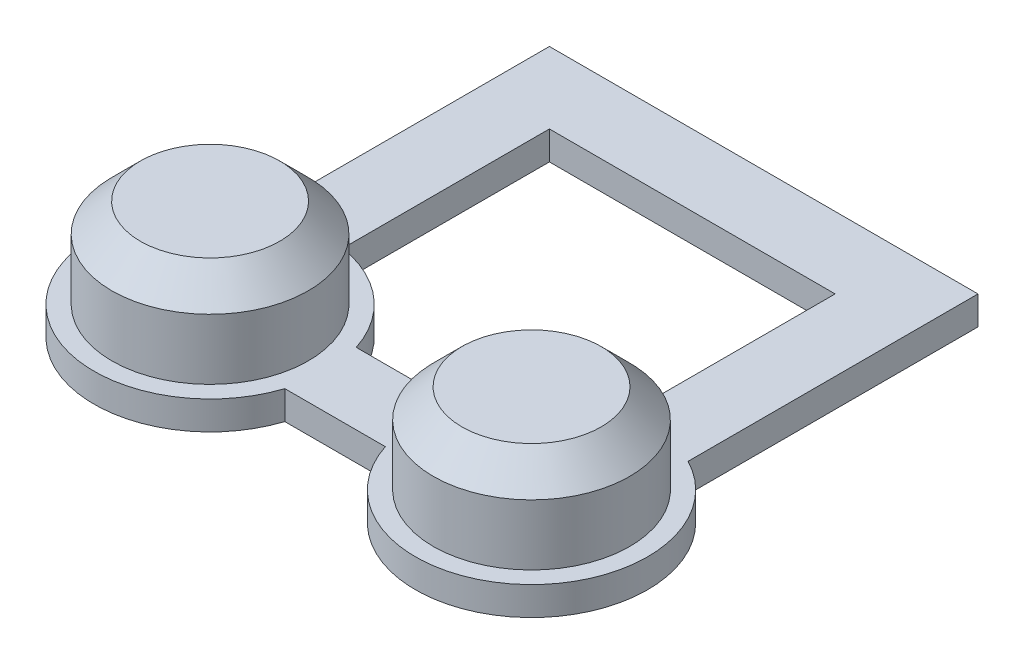
ISO-10303-21;
HEADER;
FILE_DESCRIPTION(('STEP AP214'),'2;1');
FILE_NAME('part.step','',(''),(''),'','','');
FILE_SCHEMA(('AUTOMOTIVE_DESIGN { 1 0 10303 214 1 1 1 1 }'));
ENDSEC;
DATA;
#1=APPLICATION_CONTEXT('core data for automotive mechanical design processes');
#2=APPLICATION_PROTOCOL_DEFINITION('international standard','automotive_design',2000,#1);
#3=PRODUCT_CONTEXT('',#1,'mechanical');
#4=PRODUCT('Part','Part','',(#3));
#5=PRODUCT_RELATED_PRODUCT_CATEGORY('part','',(#4));
#6=PRODUCT_DEFINITION_FORMATION('','',#4);
#7=PRODUCT_DEFINITION_CONTEXT('part definition',#1,'design');
#8=PRODUCT_DEFINITION('design','',#6,#7);
#9=PRODUCT_DEFINITION_SHAPE('','',#8);
#10=(LENGTH_UNIT() NAMED_UNIT(*) SI_UNIT(.MILLI.,.METRE.));
#11=(NAMED_UNIT(*) PLANE_ANGLE_UNIT() SI_UNIT($,.RADIAN.));
#12=(NAMED_UNIT(*) SI_UNIT($,.STERADIAN.) SOLID_ANGLE_UNIT());
#13=UNCERTAINTY_MEASURE_WITH_UNIT(LENGTH_MEASURE(1.E-05),#10,'distance_accuracy_value','');
#14=(GEOMETRIC_REPRESENTATION_CONTEXT(3) GLOBAL_UNCERTAINTY_ASSIGNED_CONTEXT((#13)) GLOBAL_UNIT_ASSIGNED_CONTEXT((#10,
#11,#12)) REPRESENTATION_CONTEXT('',''));
#15=CARTESIAN_POINT('',(0.,0.,0.));
#16=DIRECTION('',(0.,0.,1.));
#17=DIRECTION('',(1.,0.,0.));
#18=AXIS2_PLACEMENT_3D('',#15,#16,#17);
#19=CARTESIAN_POINT('',(-4.5,0.8,0.));
#20=DIRECTION('',(0.,-1.,0.));
#21=DIRECTION('',(0.,0.,-1.));
#22=AXIS2_PLACEMENT_3D('',#19,#20,#21);
#23=CYLINDRICAL_SURFACE('',#22,3.25);
#24=DIRECTION('',(0.,-1.,0.));
#25=VECTOR('',#24,1.);
#26=CARTESIAN_POINT('',(-4.,0.8,-3.21130814466628));
#27=LINE('',#26,#25);
#28=CARTESIAN_POINT('',(-4.,0.8,-3.21130814466628));
#29=VERTEX_POINT('',#28);
#30=CARTESIAN_POINT('',(-4.,0.,-3.21130814466628));
#31=VERTEX_POINT('',#30);
#32=EDGE_CURVE('E211',#29,#31,#27,.T.);
#33=ORIENTED_EDGE('',*,*,#32,.F.);
#34=CARTESIAN_POINT('',(-4.5,0.8,0.));
#35=DIRECTION('',(0.,1.,0.));
#36=DIRECTION('',(0.,0.,1.));
#37=AXIS2_PLACEMENT_3D('',#34,#35,#36);
#38=CIRCLE('',#37,3.25);
#39=CARTESIAN_POINT('',(-1.40767078078675,0.8,-1.));
#40=VERTEX_POINT('',#39);
#41=EDGE_CURVE('E146',#40,#29,#38,.T.);
#42=ORIENTED_EDGE('',*,*,#41,.F.);
#43=DIRECTION('',(0.,-1.,0.));
#44=VECTOR('',#43,1.);
#45=CARTESIAN_POINT('',(-1.40767078078675,0.8,-1.));
#46=LINE('',#45,#44);
#47=CARTESIAN_POINT('',(-1.40767078078675,0.,-1.));
#48=VERTEX_POINT('',#47);
#49=EDGE_CURVE('E209',#48,#40,#46,.F.);
#50=ORIENTED_EDGE('',*,*,#49,.F.);
#51=CARTESIAN_POINT('',(-4.5,0.,0.));
#52=DIRECTION('',(0.,1.,0.));
#53=DIRECTION('',(0.,0.,1.));
#54=AXIS2_PLACEMENT_3D('',#51,#52,#53);
#55=CIRCLE('',#54,3.25);
#56=EDGE_CURVE('E245',#48,#31,#55,.T.);
#57=ORIENTED_EDGE('',*,*,#56,.T.);
#58=EDGE_LOOP('',(#33,#42,#50,#57));
#59=FACE_BOUND('',#58,.T.);
#60=ADVANCED_FACE('F47',(#59),#23,.T.);
#61=CARTESIAN_POINT('',(-6.,0.8,-2.8831406486677));
#62=VERTEX_POINT('',#61);
#63=CARTESIAN_POINT('',(-1.40767078078675,0.8,1.));
#64=VERTEX_POINT('',#63);
#65=EDGE_CURVE('E237',#62,#64,#38,.T.);
#66=ORIENTED_EDGE('',*,*,#65,.F.);
#67=DIRECTION('',(0.,-1.,0.));
#68=VECTOR('',#67,1.);
#69=CARTESIAN_POINT('',(-6.,0.8,-2.8831406486677));
#70=LINE('',#69,#68);
#71=CARTESIAN_POINT('',(-6.,0.,-2.8831406486677));
#72=VERTEX_POINT('',#71);
#73=EDGE_CURVE('E218',#62,#72,#70,.T.);
#74=ORIENTED_EDGE('',*,*,#73,.T.);
#75=CARTESIAN_POINT('',(-1.40767078078675,0.,1.));
#76=VERTEX_POINT('',#75);
#77=EDGE_CURVE('E232',#72,#76,#55,.T.);
#78=ORIENTED_EDGE('',*,*,#77,.T.);
#79=DIRECTION('',(0.,-1.,0.));
#80=VECTOR('',#79,1.);
#81=CARTESIAN_POINT('',(-1.40767078078675,0.8,1.));
#82=LINE('',#81,#80);
#83=EDGE_CURVE('E216',#76,#64,#82,.F.);
#84=ORIENTED_EDGE('',*,*,#83,.T.);
#85=EDGE_LOOP('',(#66,#74,#78,#84));
#86=FACE_BOUND('',#85,.T.);
#87=ADVANCED_FACE('F285',(#86),#23,.T.);
#88=CARTESIAN_POINT('',(4.5,0.8,0.));
#89=DIRECTION('',(0.,-1.,0.));
#90=DIRECTION('',(0.,0.,-1.));
#91=AXIS2_PLACEMENT_3D('',#88,#89,#90);
#92=CYLINDRICAL_SURFACE('',#91,3.25);
#93=DIRECTION('',(0.,-1.,0.));
#94=VECTOR('',#93,1.);
#95=CARTESIAN_POINT('',(1.40767078078676,0.8,-1.));
#96=LINE('',#95,#94);
#97=CARTESIAN_POINT('',(1.40767078078676,0.8,-1.));
#98=VERTEX_POINT('',#97);
#99=CARTESIAN_POINT('',(1.40767078078676,0.,-1.));
#100=VERTEX_POINT('',#99);
#101=EDGE_CURVE('E207',#98,#100,#96,.T.);
#102=ORIENTED_EDGE('',*,*,#101,.F.);
#103=CARTESIAN_POINT('',(4.5,0.8,0.));
#104=DIRECTION('',(0.,1.,0.));
#105=DIRECTION('',(0.,0.,1.));
#106=AXIS2_PLACEMENT_3D('',#103,#104,#105);
#107=CIRCLE('',#106,3.25);
#108=CARTESIAN_POINT('',(4.,0.8,-3.21130814466628));
#109=VERTEX_POINT('',#108);
#110=EDGE_CURVE('E241',#109,#98,#107,.T.);
#111=ORIENTED_EDGE('',*,*,#110,.F.);
#112=DIRECTION('',(0.,-1.,0.));
#113=VECTOR('',#112,1.);
#114=CARTESIAN_POINT('',(4.,0.8,-3.21130814466628));
#115=LINE('',#114,#113);
#116=CARTESIAN_POINT('',(4.,0.,-3.21130814466628));
#117=VERTEX_POINT('',#116);
#118=EDGE_CURVE('E202',#117,#109,#115,.F.);
#119=ORIENTED_EDGE('',*,*,#118,.F.);
#120=CARTESIAN_POINT('',(4.5,0.,0.));
#121=DIRECTION('',(0.,1.,0.));
#122=DIRECTION('',(0.,0.,1.));
#123=AXIS2_PLACEMENT_3D('',#120,#121,#122);
#124=CIRCLE('',#123,3.25);
#125=EDGE_CURVE('E246',#117,#100,#124,.T.);
#126=ORIENTED_EDGE('',*,*,#125,.T.);
#127=EDGE_LOOP('',(#102,#111,#119,#126));
#128=FACE_BOUND('',#127,.T.);
#129=ADVANCED_FACE('F292',(#128),#92,.T.);
#130=CARTESIAN_POINT('',(1.40767078078676,0.8,1.));
#131=VERTEX_POINT('',#130);
#132=CARTESIAN_POINT('',(6.,0.8,-2.8831406486677));
#133=VERTEX_POINT('',#132);
#134=EDGE_CURVE('E67',#131,#133,#107,.T.);
#135=ORIENTED_EDGE('',*,*,#134,.F.);
#136=DIRECTION('',(0.,-1.,0.));
#137=VECTOR('',#136,1.);
#138=CARTESIAN_POINT('',(1.40767078078676,0.8,1.));
#139=LINE('',#138,#137);
#140=CARTESIAN_POINT('',(1.40767078078676,0.,1.));
#141=VERTEX_POINT('',#140);
#142=EDGE_CURVE('E214',#131,#141,#139,.T.);
#143=ORIENTED_EDGE('',*,*,#142,.T.);
#144=CARTESIAN_POINT('',(6.,0.,-2.8831406486677));
#145=VERTEX_POINT('',#144);
#146=EDGE_CURVE('E240',#141,#145,#124,.T.);
#147=ORIENTED_EDGE('',*,*,#146,.T.);
#148=DIRECTION('',(0.,-1.,0.));
#149=VECTOR('',#148,1.);
#150=CARTESIAN_POINT('',(6.,0.8,-2.8831406486677));
#151=LINE('',#150,#149);
#152=EDGE_CURVE('E63',#145,#133,#151,.F.);
#153=ORIENTED_EDGE('',*,*,#152,.T.);
#154=EDGE_LOOP('',(#135,#143,#147,#153));
#155=FACE_BOUND('',#154,.T.);
#156=ADVANCED_FACE('F295',(#155),#92,.T.);
#157=CARTESIAN_POINT('',(0.,0.8,0.));
#158=DIRECTION('',(0.,1.,0.));
#159=DIRECTION('',(0.,0.,1.));
#160=AXIS2_PLACEMENT_3D('',#157,#158,#159);
#161=PLANE('',#160);
#162=DIRECTION('',(-1.,0.,0.));
#163=VECTOR('',#162,1.);
#164=CARTESIAN_POINT('',(-4.,0.8,-1.));
#165=LINE('',#164,#163);
#166=EDGE_CURVE('E160',#98,#40,#165,.T.);
#167=ORIENTED_EDGE('',*,*,#166,.T.);
#168=ORIENTED_EDGE('',*,*,#41,.T.);
#169=DIRECTION('',(0.,0.,-1.));
#170=VECTOR('',#169,1.);
#171=CARTESIAN_POINT('',(-4.,0.8,-1.));
#172=LINE('',#171,#170);
#173=CARTESIAN_POINT('',(-4.,0.8,-9.));
#174=VERTEX_POINT('',#173);
#175=EDGE_CURVE('E137',#29,#174,#172,.T.);
#176=ORIENTED_EDGE('',*,*,#175,.T.);
#177=DIRECTION('',(1.,0.,0.));
#178=VECTOR('',#177,1.);
#179=CARTESIAN_POINT('',(-4.,0.8,-9.));
#180=LINE('',#179,#178);
#181=CARTESIAN_POINT('',(4.,0.8,-9.));
#182=VERTEX_POINT('',#181);
#183=EDGE_CURVE('E144',#174,#182,#180,.T.);
#184=ORIENTED_EDGE('',*,*,#183,.T.);
#185=DIRECTION('',(0.,0.,1.));
#186=VECTOR('',#185,1.);
#187=CARTESIAN_POINT('',(4.,0.8,-1.));
#188=LINE('',#187,#186);
#189=EDGE_CURVE('E164',#182,#109,#188,.T.);
#190=ORIENTED_EDGE('',*,*,#189,.T.);
#191=ORIENTED_EDGE('',*,*,#110,.T.);
#192=EDGE_LOOP('',(#167,#168,#176,#184,#190,#191));
#193=FACE_BOUND('',#192,.T.);
#194=ORIENTED_EDGE('',*,*,#65,.T.);
#195=DIRECTION('',(-1.,0.,0.));
#196=VECTOR('',#195,1.);
#197=CARTESIAN_POINT('',(-6.,0.8,1.));
#198=LINE('',#197,#196);
#199=EDGE_CURVE('E187',#131,#64,#198,.T.);
#200=ORIENTED_EDGE('',*,*,#199,.F.);
#201=ORIENTED_EDGE('',*,*,#134,.T.);
#202=DIRECTION('',(0.,0.,1.));
#203=VECTOR('',#202,1.);
#204=CARTESIAN_POINT('',(6.,0.8,1.));
#205=LINE('',#204,#203);
#206=CARTESIAN_POINT('',(6.,0.8,-11.));
#207=VERTEX_POINT('',#206);
#208=EDGE_CURVE('E184',#207,#133,#205,.T.);
#209=ORIENTED_EDGE('',*,*,#208,.F.);
#210=DIRECTION('',(1.,0.,0.));
#211=VECTOR('',#210,1.);
#212=CARTESIAN_POINT('',(-6.,0.8,-11.));
#213=LINE('',#212,#211);
#214=CARTESIAN_POINT('',(-6.,0.8,-11.));
#215=VERTEX_POINT('',#214);
#216=EDGE_CURVE('E180',#215,#207,#213,.T.);
#217=ORIENTED_EDGE('',*,*,#216,.F.);
#218=DIRECTION('',(0.,0.,-1.));
#219=VECTOR('',#218,1.);
#220=CARTESIAN_POINT('',(-6.,0.8,1.));
#221=LINE('',#220,#219);
#222=EDGE_CURVE('E178',#62,#215,#221,.T.);
#223=ORIENTED_EDGE('',*,*,#222,.F.);
#224=EDGE_LOOP('',(#194,#200,#201,#209,#217,#223));
#225=FACE_BOUND('',#224,.T.);
#226=CARTESIAN_POINT('',(-4.5,0.8,0.));
#227=DIRECTION('',(0.,1.,0.));
#228=DIRECTION('',(0.,0.,1.));
#229=AXIS2_PLACEMENT_3D('',#226,#227,#228);
#230=CIRCLE('',#229,2.75);
#231=CARTESIAN_POINT('',(-4.5,0.8,2.75));
#232=VERTEX_POINT('',#231);
#233=EDGE_CURVE('E233',#232,#232,#230,.T.);
#234=ORIENTED_EDGE('',*,*,#233,.F.);
#235=EDGE_LOOP('',(#234));
#236=FACE_BOUND('',#235,.T.);
#237=CARTESIAN_POINT('',(4.5,0.8,0.));
#238=DIRECTION('',(0.,1.,0.));
#239=DIRECTION('',(0.,0.,1.));
#240=AXIS2_PLACEMENT_3D('',#237,#238,#239);
#241=CIRCLE('',#240,2.75);
#242=CARTESIAN_POINT('',(4.5,0.8,2.75));
#243=VERTEX_POINT('',#242);
#244=EDGE_CURVE('E226',#243,#243,#241,.T.);
#245=ORIENTED_EDGE('',*,*,#244,.F.);
#246=EDGE_LOOP('',(#245));
#247=FACE_BOUND('',#246,.T.);
#248=ADVANCED_FACE('F140',(#193,#225,#236,#247),#161,.T.);
#249=CARTESIAN_POINT('',(0.,0.,0.));
#250=DIRECTION('',(0.,1.,0.));
#251=DIRECTION('',(0.,0.,1.));
#252=AXIS2_PLACEMENT_3D('',#249,#250,#251);
#253=PLANE('',#252);
#254=ORIENTED_EDGE('',*,*,#56,.F.);
#255=DIRECTION('',(-1.,0.,0.));
#256=VECTOR('',#255,1.);
#257=CARTESIAN_POINT('',(-4.,0.,-1.));
#258=LINE('',#257,#256);
#259=EDGE_CURVE('E149',#100,#48,#258,.T.);
#260=ORIENTED_EDGE('',*,*,#259,.F.);
#261=ORIENTED_EDGE('',*,*,#125,.F.);
#262=DIRECTION('',(0.,0.,1.));
#263=VECTOR('',#262,1.);
#264=CARTESIAN_POINT('',(4.,0.,-1.));
#265=LINE('',#264,#263);
#266=CARTESIAN_POINT('',(4.,0.,-9.));
#267=VERTEX_POINT('',#266);
#268=EDGE_CURVE('E172',#267,#117,#265,.T.);
#269=ORIENTED_EDGE('',*,*,#268,.F.);
#270=DIRECTION('',(1.,0.,0.));
#271=VECTOR('',#270,1.);
#272=CARTESIAN_POINT('',(-4.,0.,-9.));
#273=LINE('',#272,#271);
#274=CARTESIAN_POINT('',(-4.,0.,-9.00000000000001));
#275=VERTEX_POINT('',#274);
#276=EDGE_CURVE('E170',#275,#267,#273,.T.);
#277=ORIENTED_EDGE('',*,*,#276,.F.);
#278=DIRECTION('',(0.,0.,-1.));
#279=VECTOR('',#278,1.);
#280=CARTESIAN_POINT('',(-4.,0.,-1.));
#281=LINE('',#280,#279);
#282=EDGE_CURVE('E155',#31,#275,#281,.T.);
#283=ORIENTED_EDGE('',*,*,#282,.F.);
#284=EDGE_LOOP('',(#254,#260,#261,#269,#277,#283));
#285=FACE_BOUND('',#284,.T.);
#286=DIRECTION('',(-1.,0.,0.));
#287=VECTOR('',#286,1.);
#288=CARTESIAN_POINT('',(-6.,0.,1.));
#289=LINE('',#288,#287);
#290=EDGE_CURVE('E181',#141,#76,#289,.T.);
#291=ORIENTED_EDGE('',*,*,#290,.T.);
#292=ORIENTED_EDGE('',*,*,#77,.F.);
#293=DIRECTION('',(0.,0.,-1.));
#294=VECTOR('',#293,1.);
#295=CARTESIAN_POINT('',(-6.,0.,1.));
#296=LINE('',#295,#294);
#297=CARTESIAN_POINT('',(-6.,0.,-11.));
#298=VERTEX_POINT('',#297);
#299=EDGE_CURVE('E176',#72,#298,#296,.T.);
#300=ORIENTED_EDGE('',*,*,#299,.T.);
#301=DIRECTION('',(1.,0.,0.));
#302=VECTOR('',#301,1.);
#303=CARTESIAN_POINT('',(-6.,0.,-11.));
#304=LINE('',#303,#302);
#305=CARTESIAN_POINT('',(6.,0.,-11.));
#306=VERTEX_POINT('',#305);
#307=EDGE_CURVE('E192',#298,#306,#304,.T.);
#308=ORIENTED_EDGE('',*,*,#307,.T.);
#309=DIRECTION('',(0.,0.,1.));
#310=VECTOR('',#309,1.);
#311=CARTESIAN_POINT('',(6.,0.,1.));
#312=LINE('',#311,#310);
#313=EDGE_CURVE('E195',#306,#145,#312,.T.);
#314=ORIENTED_EDGE('',*,*,#313,.T.);
#315=ORIENTED_EDGE('',*,*,#146,.F.);
#316=EDGE_LOOP('',(#291,#292,#300,#308,#314,#315));
#317=FACE_BOUND('',#316,.T.);
#318=CARTESIAN_POINT('',(-4.5,0.,0.));
#319=DIRECTION('',(0.,-1.,0.));
#320=DIRECTION('',(0.,0.,-1.));
#321=AXIS2_PLACEMENT_3D('',#318,#319,#320);
#322=CIRCLE('',#321,1.);
#323=CARTESIAN_POINT('',(-4.5,0.,-1.));
#324=VERTEX_POINT('',#323);
#325=EDGE_CURVE('E56',#324,#324,#322,.T.);
#326=ORIENTED_EDGE('',*,*,#325,.F.);
#327=EDGE_LOOP('',(#326));
#328=FACE_BOUND('',#327,.T.);
#329=CARTESIAN_POINT('',(4.5,0.,0.));
#330=DIRECTION('',(0.,1.,0.));
#331=DIRECTION('',(0.,0.,1.));
#332=AXIS2_PLACEMENT_3D('',#329,#330,#331);
#333=CIRCLE('',#332,1.);
#334=CARTESIAN_POINT('',(4.5,0.,0.999999999999999));
#335=VERTEX_POINT('',#334);
#336=EDGE_CURVE('E11',#335,#335,#333,.F.);
#337=ORIENTED_EDGE('',*,*,#336,.F.);
#338=EDGE_LOOP('',(#337));
#339=FACE_BOUND('',#338,.T.);
#340=ADVANCED_FACE('F281',(#285,#317,#328,#339),#253,.F.);
#341=CARTESIAN_POINT('',(-4.5,3.3,0.));
#342=DIRECTION('',(0.,-1.,0.));
#343=DIRECTION('',(0.,0.,-1.));
#344=AXIS2_PLACEMENT_3D('',#341,#342,#343);
#345=CYLINDRICAL_SURFACE('',#344,2.75);
#346=CARTESIAN_POINT('',(-4.5,2.5,0.));
#347=DIRECTION('',(0.,1.,0.));
#348=DIRECTION('',(0.,0.,1.));
#349=AXIS2_PLACEMENT_3D('',#346,#347,#348);
#350=CIRCLE('',#349,2.75);
#351=CARTESIAN_POINT('',(-4.5,2.5,2.75));
#352=VERTEX_POINT('',#351);
#353=EDGE_CURVE('E229',#352,#352,#350,.F.);
#354=ORIENTED_EDGE('',*,*,#353,.T.);
#355=EDGE_LOOP('',(#354));
#356=FACE_BOUND('',#355,.T.);
#357=ORIENTED_EDGE('',*,*,#233,.T.);
#358=EDGE_LOOP('',(#357));
#359=FACE_BOUND('',#358,.T.);
#360=ADVANCED_FACE('F259',(#356,#359),#345,.T.);
#361=CARTESIAN_POINT('',(-4.5,3.3,0.));
#362=DIRECTION('',(0.,1.,0.));
#363=DIRECTION('',(0.,0.,1.));
#364=AXIS2_PLACEMENT_3D('',#361,#362,#363);
#365=PLANE('',#364);
#366=CARTESIAN_POINT('',(-4.5,3.3,0.));
#367=DIRECTION('',(0.,1.,0.));
#368=DIRECTION('',(0.,0.,1.));
#369=AXIS2_PLACEMENT_3D('',#366,#367,#368);
#370=CIRCLE('',#369,1.95);
#371=CARTESIAN_POINT('',(-4.5,3.3,1.95));
#372=VERTEX_POINT('',#371);
#373=EDGE_CURVE('E254',#372,#372,#370,.T.);
#374=ORIENTED_EDGE('',*,*,#373,.T.);
#375=EDGE_LOOP('',(#374));
#376=FACE_BOUND('',#375,.T.);
#377=ADVANCED_FACE('F268',(#376),#365,.T.);
#378=CARTESIAN_POINT('',(4.5,3.3,0.));
#379=DIRECTION('',(0.,-1.,0.));
#380=DIRECTION('',(0.,0.,-1.));
#381=AXIS2_PLACEMENT_3D('',#378,#379,#380);
#382=CYLINDRICAL_SURFACE('',#381,2.75);
#383=CARTESIAN_POINT('',(4.5,2.5,0.));
#384=DIRECTION('',(0.,1.,0.));
#385=DIRECTION('',(0.,0.,1.));
#386=AXIS2_PLACEMENT_3D('',#383,#384,#385);
#387=CIRCLE('',#386,2.75);
#388=CARTESIAN_POINT('',(4.5,2.5,2.75));
#389=VERTEX_POINT('',#388);
#390=EDGE_CURVE('E251',#389,#389,#387,.F.);
#391=ORIENTED_EDGE('',*,*,#390,.T.);
#392=EDGE_LOOP('',(#391));
#393=FACE_BOUND('',#392,.T.);
#394=ORIENTED_EDGE('',*,*,#244,.T.);
#395=EDGE_LOOP('',(#394));
#396=FACE_BOUND('',#395,.T.);
#397=ADVANCED_FACE('F270',(#393,#396),#382,.T.);
#398=CARTESIAN_POINT('',(4.5,3.3,0.));
#399=DIRECTION('',(0.,1.,0.));
#400=DIRECTION('',(0.,0.,1.));
#401=AXIS2_PLACEMENT_3D('',#398,#399,#400);
#402=PLANE('',#401);
#403=CARTESIAN_POINT('',(4.5,3.3,0.));
#404=DIRECTION('',(0.,1.,0.));
#405=DIRECTION('',(0.,0.,1.));
#406=AXIS2_PLACEMENT_3D('',#403,#404,#405);
#407=CIRCLE('',#406,1.95);
#408=CARTESIAN_POINT('',(4.5,3.3,1.95));
#409=VERTEX_POINT('',#408);
#410=EDGE_CURVE('E236',#409,#409,#407,.T.);
#411=ORIENTED_EDGE('',*,*,#410,.T.);
#412=EDGE_LOOP('',(#411));
#413=FACE_BOUND('',#412,.T.);
#414=ADVANCED_FACE('F277',(#413),#402,.T.);
#415=CARTESIAN_POINT('',(4.5,3.3,0.));
#416=DIRECTION('',(0.,-1.,0.));
#417=DIRECTION('',(0.,0.,-1.));
#418=AXIS2_PLACEMENT_3D('',#415,#416,#417);
#419=CONICAL_SURFACE('',#418,1.95,0.785398163397447);
#420=ORIENTED_EDGE('',*,*,#390,.F.);
#421=EDGE_LOOP('',(#420));
#422=FACE_BOUND('',#421,.T.);
#423=ORIENTED_EDGE('',*,*,#410,.F.);
#424=EDGE_LOOP('',(#423));
#425=FACE_BOUND('',#424,.T.);
#426=ADVANCED_FACE('F265',(#422,#425),#419,.T.);
#427=CARTESIAN_POINT('',(-4.5,3.3,0.));
#428=DIRECTION('',(0.,-1.,0.));
#429=DIRECTION('',(0.,0.,-1.));
#430=AXIS2_PLACEMENT_3D('',#427,#428,#429);
#431=CONICAL_SURFACE('',#430,1.95,0.785398163397447);
#432=ORIENTED_EDGE('',*,*,#353,.F.);
#433=EDGE_LOOP('',(#432));
#434=FACE_BOUND('',#433,.T.);
#435=ORIENTED_EDGE('',*,*,#373,.F.);
#436=EDGE_LOOP('',(#435));
#437=FACE_BOUND('',#436,.T.);
#438=ADVANCED_FACE('F50',(#434,#437),#431,.T.);
#439=CARTESIAN_POINT('',(-4.5,-0.45,0.));
#440=DIRECTION('',(0.,1.,0.));
#441=DIRECTION('',(0.,0.,1.));
#442=AXIS2_PLACEMENT_3D('',#439,#440,#441);
#443=CYLINDRICAL_SURFACE('',#442,1.);
#444=CARTESIAN_POINT('',(-4.5,-0.45,0.));
#445=DIRECTION('',(0.,-1.,0.));
#446=DIRECTION('',(0.,0.,-1.));
#447=AXIS2_PLACEMENT_3D('',#444,#445,#446);
#448=CIRCLE('',#447,1.);
#449=CARTESIAN_POINT('',(-4.5,-0.45,-1.));
#450=VERTEX_POINT('',#449);
#451=EDGE_CURVE('E223',#450,#450,#448,.T.);
#452=ORIENTED_EDGE('',*,*,#451,.F.);
#453=EDGE_LOOP('',(#452));
#454=FACE_BOUND('',#453,.T.);
#455=ORIENTED_EDGE('',*,*,#325,.T.);
#456=EDGE_LOOP('',(#455));
#457=FACE_BOUND('',#456,.T.);
#458=ADVANCED_FACE('F264',(#454,#457),#443,.T.);
#459=CARTESIAN_POINT('',(-4.5,-0.45,0.));
#460=DIRECTION('',(0.,-1.,0.));
#461=DIRECTION('',(0.,0.,-1.));
#462=AXIS2_PLACEMENT_3D('',#459,#460,#461);
#463=PLANE('',#462);
#464=ORIENTED_EDGE('',*,*,#451,.T.);
#465=EDGE_LOOP('',(#464));
#466=FACE_BOUND('',#465,.T.);
#467=ADVANCED_FACE('F370',(#466),#463,.T.);
#468=CARTESIAN_POINT('',(4.5,-0.45,0.));
#469=DIRECTION('',(0.,1.,0.));
#470=DIRECTION('',(0.,0.,1.));
#471=AXIS2_PLACEMENT_3D('',#468,#469,#470);
#472=CYLINDRICAL_SURFACE('',#471,1.);
#473=CARTESIAN_POINT('',(4.5,-0.45,0.));
#474=DIRECTION('',(0.,-1.,0.));
#475=DIRECTION('',(0.,0.,-1.));
#476=AXIS2_PLACEMENT_3D('',#473,#474,#475);
#477=CIRCLE('',#476,1.);
#478=CARTESIAN_POINT('',(4.5,-0.45,-1.));
#479=VERTEX_POINT('',#478);
#480=EDGE_CURVE('E220',#479,#479,#477,.T.);
#481=ORIENTED_EDGE('',*,*,#480,.F.);
#482=EDGE_LOOP('',(#481));
#483=FACE_BOUND('',#482,.T.);
#484=ORIENTED_EDGE('',*,*,#336,.T.);
#485=EDGE_LOOP('',(#484));
#486=FACE_BOUND('',#485,.T.);
#487=ADVANCED_FACE('F346',(#483,#486),#472,.T.);
#488=CARTESIAN_POINT('',(4.5,-0.45,0.));
#489=DIRECTION('',(0.,-1.,0.));
#490=DIRECTION('',(0.,0.,-1.));
#491=AXIS2_PLACEMENT_3D('',#488,#489,#490);
#492=PLANE('',#491);
#493=ORIENTED_EDGE('',*,*,#480,.T.);
#494=EDGE_LOOP('',(#493));
#495=FACE_BOUND('',#494,.T.);
#496=ADVANCED_FACE('F338',(#495),#492,.T.);
#497=CARTESIAN_POINT('',(-4.,0.8,-1.));
#498=DIRECTION('',(0.,0.,1.));
#499=DIRECTION('',(1.,0.,0.));
#500=AXIS2_PLACEMENT_3D('',#497,#498,#499);
#501=PLANE('',#500);
#502=ORIENTED_EDGE('',*,*,#259,.T.);
#503=ORIENTED_EDGE('',*,*,#49,.T.);
#504=ORIENTED_EDGE('',*,*,#166,.F.);
#505=ORIENTED_EDGE('',*,*,#101,.T.);
#506=EDGE_LOOP('',(#502,#503,#504,#505));
#507=FACE_BOUND('',#506,.T.);
#508=ADVANCED_FACE('F336',(#507),#501,.F.);
#509=CARTESIAN_POINT('',(-4.,0.8,-9.));
#510=DIRECTION('',(0.,0.,-1.));
#511=DIRECTION('',(-1.,0.,0.));
#512=AXIS2_PLACEMENT_3D('',#509,#510,#511);
#513=PLANE('',#512);
#514=ORIENTED_EDGE('',*,*,#276,.T.);
#515=DIRECTION('',(0.,-1.,0.));
#516=VECTOR('',#515,1.);
#517=CARTESIAN_POINT('',(4.,0.8,-9.));
#518=LINE('',#517,#516);
#519=EDGE_CURVE('E159',#182,#267,#518,.T.);
#520=ORIENTED_EDGE('',*,*,#519,.F.);
#521=ORIENTED_EDGE('',*,*,#183,.F.);
#522=DIRECTION('',(0.,-1.,0.));
#523=VECTOR('',#522,1.);
#524=CARTESIAN_POINT('',(-4.,0.8,-9.));
#525=LINE('',#524,#523);
#526=EDGE_CURVE('E152',#174,#275,#525,.T.);
#527=ORIENTED_EDGE('',*,*,#526,.T.);
#528=EDGE_LOOP('',(#514,#520,#521,#527));
#529=FACE_BOUND('',#528,.T.);
#530=ADVANCED_FACE('F163',(#529),#513,.F.);
#531=CARTESIAN_POINT('',(-6.,0.8,-11.));
#532=DIRECTION('',(0.,0.,-1.));
#533=DIRECTION('',(-1.,0.,0.));
#534=AXIS2_PLACEMENT_3D('',#531,#532,#533);
#535=PLANE('',#534);
#536=ORIENTED_EDGE('',*,*,#307,.F.);
#537=DIRECTION('',(0.,-1.,0.));
#538=VECTOR('',#537,1.);
#539=CARTESIAN_POINT('',(-6.,0.8,-11.));
#540=LINE('',#539,#538);
#541=EDGE_CURVE('E190',#215,#298,#540,.T.);
#542=ORIENTED_EDGE('',*,*,#541,.F.);
#543=ORIENTED_EDGE('',*,*,#216,.T.);
#544=DIRECTION('',(0.,-1.,0.));
#545=VECTOR('',#544,1.);
#546=CARTESIAN_POINT('',(6.,0.8,-11.));
#547=LINE('',#546,#545);
#548=EDGE_CURVE('E200',#207,#306,#547,.T.);
#549=ORIENTED_EDGE('',*,*,#548,.T.);
#550=EDGE_LOOP('',(#536,#542,#543,#549));
#551=FACE_BOUND('',#550,.T.);
#552=ADVANCED_FACE('F343',(#551),#535,.T.);
#553=CARTESIAN_POINT('',(4.,0.8,-1.));
#554=DIRECTION('',(1.,0.,0.));
#555=DIRECTION('',(0.,0.,-1.));
#556=AXIS2_PLACEMENT_3D('',#553,#554,#555);
#557=PLANE('',#556);
#558=ORIENTED_EDGE('',*,*,#268,.T.);
#559=ORIENTED_EDGE('',*,*,#118,.T.);
#560=ORIENTED_EDGE('',*,*,#189,.F.);
#561=ORIENTED_EDGE('',*,*,#519,.T.);
#562=EDGE_LOOP('',(#558,#559,#560,#561));
#563=FACE_BOUND('',#562,.T.);
#564=ADVANCED_FACE('F331',(#563),#557,.F.);
#565=CARTESIAN_POINT('',(-4.,0.8,-1.));
#566=DIRECTION('',(-1.,0.,0.));
#567=DIRECTION('',(0.,0.,1.));
#568=AXIS2_PLACEMENT_3D('',#565,#566,#567);
#569=PLANE('',#568);
#570=ORIENTED_EDGE('',*,*,#175,.F.);
#571=ORIENTED_EDGE('',*,*,#32,.T.);
#572=ORIENTED_EDGE('',*,*,#282,.T.);
#573=ORIENTED_EDGE('',*,*,#526,.F.);
#574=EDGE_LOOP('',(#570,#571,#572,#573));
#575=FACE_BOUND('',#574,.T.);
#576=ADVANCED_FACE('F153',(#575),#569,.F.);
#577=CARTESIAN_POINT('',(6.,0.8,1.));
#578=DIRECTION('',(1.,0.,0.));
#579=DIRECTION('',(0.,0.,-1.));
#580=AXIS2_PLACEMENT_3D('',#577,#578,#579);
#581=PLANE('',#580);
#582=ORIENTED_EDGE('',*,*,#152,.F.);
#583=ORIENTED_EDGE('',*,*,#313,.F.);
#584=ORIENTED_EDGE('',*,*,#548,.F.);
#585=ORIENTED_EDGE('',*,*,#208,.T.);
#586=EDGE_LOOP('',(#582,#583,#584,#585));
#587=FACE_BOUND('',#586,.T.);
#588=ADVANCED_FACE('F354',(#587),#581,.T.);
#589=CARTESIAN_POINT('',(-6.,0.8,1.));
#590=DIRECTION('',(-1.,0.,0.));
#591=DIRECTION('',(0.,0.,1.));
#592=AXIS2_PLACEMENT_3D('',#589,#590,#591);
#593=PLANE('',#592);
#594=ORIENTED_EDGE('',*,*,#73,.F.);
#595=ORIENTED_EDGE('',*,*,#222,.T.);
#596=ORIENTED_EDGE('',*,*,#541,.T.);
#597=ORIENTED_EDGE('',*,*,#299,.F.);
#598=EDGE_LOOP('',(#594,#595,#596,#597));
#599=FACE_BOUND('',#598,.T.);
#600=ADVANCED_FACE('F358',(#599),#593,.T.);
#601=CARTESIAN_POINT('',(-6.,0.8,1.));
#602=DIRECTION('',(0.,0.,1.));
#603=DIRECTION('',(1.,0.,0.));
#604=AXIS2_PLACEMENT_3D('',#601,#602,#603);
#605=PLANE('',#604);
#606=ORIENTED_EDGE('',*,*,#83,.F.);
#607=ORIENTED_EDGE('',*,*,#290,.F.);
#608=ORIENTED_EDGE('',*,*,#142,.F.);
#609=ORIENTED_EDGE('',*,*,#199,.T.);
#610=EDGE_LOOP('',(#606,#607,#608,#609));
#611=FACE_BOUND('',#610,.T.);
#612=ADVANCED_FACE('F355',(#611),#605,.T.);
#613=CLOSED_SHELL('',(#60,#87,#129,#156,#248,#340,#360,#377,#397,#414,#426,#438,#458,#467,#487,
#496,#508,#530,#552,#564,#576,#588,#600,#612));
#614=MANIFOLD_SOLID_BREP('B2',#613);
#615=ADVANCED_BREP_SHAPE_REPRESENTATION('',(#18,#614),#14);
#616=SHAPE_DEFINITION_REPRESENTATION(#9,#615);
ENDSEC;
END-ISO-10303-21;
